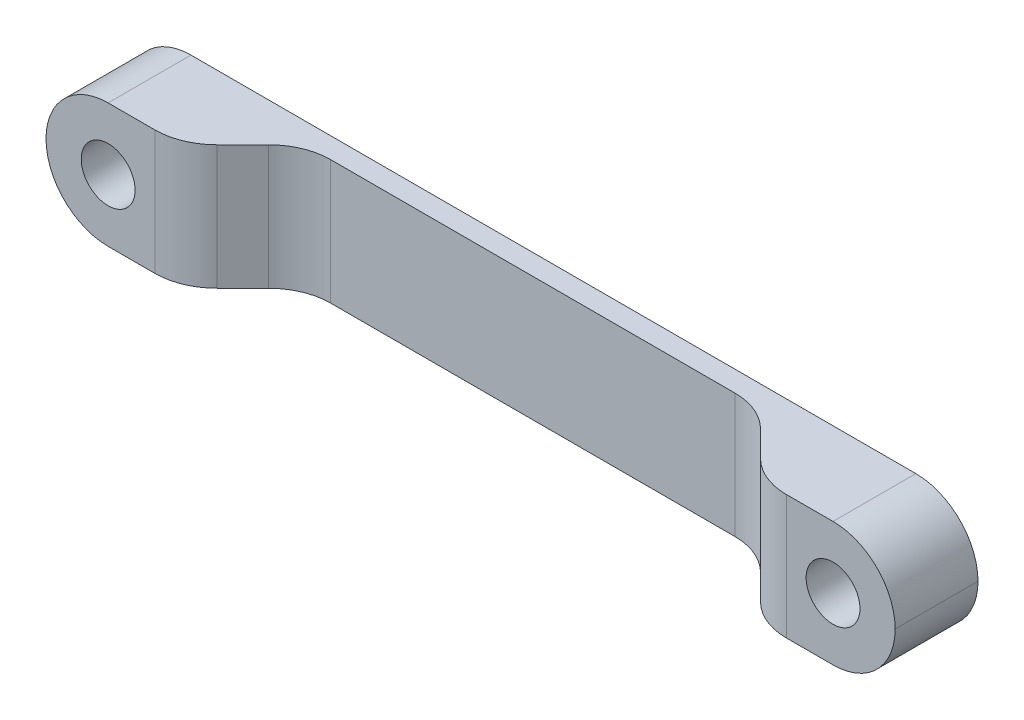
ISO-10303-21;
HEADER;
FILE_DESCRIPTION(('STEP AP214'),'2;1');
FILE_NAME('part.step','',(''),(''),'','','');
FILE_SCHEMA(('AUTOMOTIVE_DESIGN { 1 0 10303 214 1 1 1 1 }'));
ENDSEC;
DATA;
#1=APPLICATION_CONTEXT('core data for automotive mechanical design processes');
#2=APPLICATION_PROTOCOL_DEFINITION('international standard','automotive_design',2000,#1);
#3=PRODUCT_CONTEXT('',#1,'mechanical');
#4=PRODUCT('Part','Part','',(#3));
#5=PRODUCT_RELATED_PRODUCT_CATEGORY('part','',(#4));
#6=PRODUCT_DEFINITION_FORMATION('','',#4);
#7=PRODUCT_DEFINITION_CONTEXT('part definition',#1,'design');
#8=PRODUCT_DEFINITION('design','',#6,#7);
#9=PRODUCT_DEFINITION_SHAPE('','',#8);
#10=(LENGTH_UNIT() NAMED_UNIT(*) SI_UNIT(.MILLI.,.METRE.));
#11=(NAMED_UNIT(*) PLANE_ANGLE_UNIT() SI_UNIT($,.RADIAN.));
#12=(NAMED_UNIT(*) SI_UNIT($,.STERADIAN.) SOLID_ANGLE_UNIT());
#13=UNCERTAINTY_MEASURE_WITH_UNIT(LENGTH_MEASURE(1.E-05),#10,'distance_accuracy_value','');
#14=(GEOMETRIC_REPRESENTATION_CONTEXT(3) GLOBAL_UNCERTAINTY_ASSIGNED_CONTEXT((#13)) GLOBAL_UNIT_ASSIGNED_CONTEXT((#10,
#11,#12)) REPRESENTATION_CONTEXT('',''));
#15=CARTESIAN_POINT('',(0.,0.,0.));
#16=DIRECTION('',(0.,0.,1.));
#17=DIRECTION('',(1.,0.,0.));
#18=AXIS2_PLACEMENT_3D('',#15,#16,#17);
#19=CARTESIAN_POINT('',(0.,0.,4.));
#20=DIRECTION('',(0.,0.,-1.));
#21=DIRECTION('',(-1.,0.,0.));
#22=AXIS2_PLACEMENT_3D('',#19,#20,#21);
#23=PLANE('',#22);
#24=CARTESIAN_POINT('',(-17.5,0.,4.));
#25=DIRECTION('',(0.,0.,1.));
#26=DIRECTION('',(1.,0.,0.));
#27=AXIS2_PLACEMENT_3D('',#24,#25,#26);
#28=CIRCLE('',#27,1.3);
#29=CARTESIAN_POINT('',(-16.2,0.,4.));
#30=VERTEX_POINT('',#29);
#31=EDGE_CURVE('E258',#30,#30,#28,.T.);
#32=ORIENTED_EDGE('',*,*,#31,.F.);
#33=EDGE_LOOP('',(#32));
#34=FACE_BOUND('',#33,.T.);
#35=DIRECTION('',(1.,0.,0.));
#36=VECTOR('',#35,1.);
#37=CARTESIAN_POINT('',(20.5,-3.,4.));
#38=LINE('',#37,#36);
#39=CARTESIAN_POINT('',(-17.5,-3.,4.));
#40=VERTEX_POINT('',#39);
#41=CARTESIAN_POINT('',(-15.2426406871193,-3.,4.));
#42=VERTEX_POINT('',#41);
#43=EDGE_CURVE('E155',#40,#42,#38,.T.);
#44=ORIENTED_EDGE('',*,*,#43,.T.);
#45=DIRECTION('',(0.,1.,0.));
#46=VECTOR('',#45,1.);
#47=CARTESIAN_POINT('',(-15.2426406871193,3.,4.));
#48=LINE('',#47,#46);
#49=CARTESIAN_POINT('',(-15.2426406871193,3.,4.));
#50=VERTEX_POINT('',#49);
#51=EDGE_CURVE('E206',#42,#50,#48,.T.);
#52=ORIENTED_EDGE('',*,*,#51,.T.);
#53=DIRECTION('',(-1.,0.,0.));
#54=VECTOR('',#53,1.);
#55=CARTESIAN_POINT('',(-20.5,3.,4.));
#56=LINE('',#55,#54);
#57=CARTESIAN_POINT('',(-17.5,3.,4.));
#58=VERTEX_POINT('',#57);
#59=EDGE_CURVE('E264',#50,#58,#56,.T.);
#60=ORIENTED_EDGE('',*,*,#59,.T.);
#61=CARTESIAN_POINT('',(-17.5,0.,4.));
#62=DIRECTION('',(0.,0.,-1.));
#63=DIRECTION('',(-1.,0.,0.));
#64=AXIS2_PLACEMENT_3D('',#61,#62,#63);
#65=CIRCLE('',#64,3.);
#66=CARTESIAN_POINT('',(-20.5,0.,4.));
#67=VERTEX_POINT('',#66);
#68=EDGE_CURVE('E183',#58,#67,#65,.F.);
#69=ORIENTED_EDGE('',*,*,#68,.T.);
#70=CARTESIAN_POINT('',(-17.5,0.,4.));
#71=DIRECTION('',(0.,0.,-1.));
#72=DIRECTION('',(-1.,0.,0.));
#73=AXIS2_PLACEMENT_3D('',#70,#71,#72);
#74=CIRCLE('',#73,3.);
#75=EDGE_CURVE('E185',#67,#40,#74,.F.);
#76=ORIENTED_EDGE('',*,*,#75,.T.);
#77=EDGE_LOOP('',(#44,#52,#60,#69,#76));
#78=FACE_BOUND('',#77,.T.);
#79=ADVANCED_FACE('F33',(#34,#78),#23,.F.);
#80=CARTESIAN_POINT('',(17.5,0.,4.));
#81=DIRECTION('',(0.,0.,1.));
#82=DIRECTION('',(1.,0.,0.));
#83=AXIS2_PLACEMENT_3D('',#80,#81,#82);
#84=CIRCLE('',#83,1.3);
#85=CARTESIAN_POINT('',(18.8,0.,4.));
#86=VERTEX_POINT('',#85);
#87=EDGE_CURVE('E164',#86,#86,#84,.T.);
#88=ORIENTED_EDGE('',*,*,#87,.F.);
#89=EDGE_LOOP('',(#88));
#90=FACE_BOUND('',#89,.T.);
#91=CARTESIAN_POINT('',(17.5,3.,4.));
#92=VERTEX_POINT('',#91);
#93=CARTESIAN_POINT('',(15.2426406871193,3.,4.));
#94=VERTEX_POINT('',#93);
#95=EDGE_CURVE('E173',#92,#94,#56,.T.);
#96=ORIENTED_EDGE('',*,*,#95,.T.);
#97=DIRECTION('',(0.,1.,0.));
#98=VECTOR('',#97,1.);
#99=CARTESIAN_POINT('',(15.2426406871193,-3.,4.));
#100=LINE('',#99,#98);
#101=CARTESIAN_POINT('',(15.2426406871193,-3.,4.));
#102=VERTEX_POINT('',#101);
#103=EDGE_CURVE('E231',#94,#102,#100,.F.);
#104=ORIENTED_EDGE('',*,*,#103,.T.);
#105=CARTESIAN_POINT('',(17.5,-3.,4.));
#106=VERTEX_POINT('',#105);
#107=EDGE_CURVE('E167',#102,#106,#38,.T.);
#108=ORIENTED_EDGE('',*,*,#107,.T.);
#109=CARTESIAN_POINT('',(17.5,0.,4.));
#110=DIRECTION('',(0.,0.,-1.));
#111=DIRECTION('',(-1.,0.,0.));
#112=AXIS2_PLACEMENT_3D('',#109,#110,#111);
#113=CIRCLE('',#112,3.);
#114=CARTESIAN_POINT('',(20.5,0.,4.));
#115=VERTEX_POINT('',#114);
#116=EDGE_CURVE('E181',#106,#115,#113,.F.);
#117=ORIENTED_EDGE('',*,*,#116,.T.);
#118=CARTESIAN_POINT('',(17.5,0.,4.));
#119=DIRECTION('',(0.,0.,-1.));
#120=DIRECTION('',(-1.,0.,0.));
#121=AXIS2_PLACEMENT_3D('',#118,#119,#120);
#122=CIRCLE('',#121,3.);
#123=EDGE_CURVE('E144',#115,#92,#122,.F.);
#124=ORIENTED_EDGE('',*,*,#123,.T.);
#125=EDGE_LOOP('',(#96,#104,#108,#117,#124));
#126=FACE_BOUND('',#125,.T.);
#127=ADVANCED_FACE('F271',(#90,#126),#23,.F.);
#128=CARTESIAN_POINT('',(20.5,-3.,4.));
#129=DIRECTION('',(0.,1.,0.));
#130=DIRECTION('',(0.,0.,1.));
#131=AXIS2_PLACEMENT_3D('',#128,#129,#130);
#132=PLANE('',#131);
#133=DIRECTION('',(0.707106781186546,0.,-0.707106781186549));
#134=VECTOR('',#133,1.);
#135=CARTESIAN_POINT('',(3.24999999999994,-3.,-13.25));
#136=LINE('',#135,#134);
#137=CARTESIAN_POINT('',(-13.1213203435596,-3.,3.12132034355964));
#138=VERTEX_POINT('',#137);
#139=CARTESIAN_POINT('',(-11.8786796564404,-3.,1.87867965644036));
#140=VERTEX_POINT('',#139);
#141=EDGE_CURVE('E198',#138,#140,#136,.T.);
#142=ORIENTED_EDGE('',*,*,#141,.F.);
#143=CARTESIAN_POINT('',(-15.2426406871193,-3.,1.));
#144=DIRECTION('',(0.,1.,0.));
#145=DIRECTION('',(0.,0.,1.));
#146=AXIS2_PLACEMENT_3D('',#143,#144,#145);
#147=CIRCLE('',#146,3.);
#148=EDGE_CURVE('E220',#138,#42,#147,.F.);
#149=ORIENTED_EDGE('',*,*,#148,.T.);
#150=ORIENTED_EDGE('',*,*,#43,.F.);
#151=DIRECTION('',(0.,0.,-1.));
#152=VECTOR('',#151,1.);
#153=CARTESIAN_POINT('',(-17.5,-3.,4.));
#154=LINE('',#153,#152);
#155=CARTESIAN_POINT('',(-17.5,-3.,0.));
#156=VERTEX_POINT('',#155);
#157=EDGE_CURVE('E138',#40,#156,#154,.T.);
#158=ORIENTED_EDGE('',*,*,#157,.T.);
#159=DIRECTION('',(1.,0.,0.));
#160=VECTOR('',#159,1.);
#161=CARTESIAN_POINT('',(20.5,-3.,0.));
#162=LINE('',#161,#160);
#163=CARTESIAN_POINT('',(17.5,-3.,0.));
#164=VERTEX_POINT('',#163);
#165=EDGE_CURVE('E152',#156,#164,#162,.T.);
#166=ORIENTED_EDGE('',*,*,#165,.T.);
#167=DIRECTION('',(0.,0.,-1.));
#168=VECTOR('',#167,1.);
#169=CARTESIAN_POINT('',(17.5,-3.,4.));
#170=LINE('',#169,#168);
#171=EDGE_CURVE('E157',#164,#106,#170,.F.);
#172=ORIENTED_EDGE('',*,*,#171,.T.);
#173=ORIENTED_EDGE('',*,*,#107,.F.);
#174=CARTESIAN_POINT('',(15.2426406871193,-3.,1.));
#175=DIRECTION('',(0.,1.,0.));
#176=DIRECTION('',(0.,0.,1.));
#177=AXIS2_PLACEMENT_3D('',#174,#175,#176);
#178=CIRCLE('',#177,3.);
#179=CARTESIAN_POINT('',(13.1213203435596,-3.,3.12132034355964));
#180=VERTEX_POINT('',#179);
#181=EDGE_CURVE('E218',#102,#180,#178,.F.);
#182=ORIENTED_EDGE('',*,*,#181,.T.);
#183=DIRECTION('',(0.707106781186546,0.,0.707106781186549));
#184=VECTOR('',#183,1.);
#185=CARTESIAN_POINT('',(17.25,-3.,7.25));
#186=LINE('',#185,#184);
#187=CARTESIAN_POINT('',(11.8786796564404,-3.,1.87867965644036));
#188=VERTEX_POINT('',#187);
#189=EDGE_CURVE('E252',#188,#180,#186,.T.);
#190=ORIENTED_EDGE('',*,*,#189,.F.);
#191=CARTESIAN_POINT('',(9.75735931288073,-3.,4.));
#192=DIRECTION('',(0.,1.,0.));
#193=DIRECTION('',(0.,0.,1.));
#194=AXIS2_PLACEMENT_3D('',#191,#192,#193);
#195=CIRCLE('',#194,3.);
#196=CARTESIAN_POINT('',(9.75735931288073,-3.,1.));
#197=VERTEX_POINT('',#196);
#198=EDGE_CURVE('E11',#188,#197,#195,.T.);
#199=ORIENTED_EDGE('',*,*,#198,.T.);
#200=DIRECTION('',(1.,0.,0.));
#201=VECTOR('',#200,1.);
#202=CARTESIAN_POINT('',(20.5,-3.,1.));
#203=LINE('',#202,#201);
#204=CARTESIAN_POINT('',(-9.75735931288072,-3.,1.));
#205=VERTEX_POINT('',#204);
#206=EDGE_CURVE('E250',#205,#197,#203,.T.);
#207=ORIENTED_EDGE('',*,*,#206,.F.);
#208=CARTESIAN_POINT('',(-9.75735931288072,-3.,4.));
#209=DIRECTION('',(0.,1.,0.));
#210=DIRECTION('',(0.,0.,1.));
#211=AXIS2_PLACEMENT_3D('',#208,#209,#210);
#212=CIRCLE('',#211,3.);
#213=EDGE_CURVE('E235',#205,#140,#212,.T.);
#214=ORIENTED_EDGE('',*,*,#213,.T.);
#215=EDGE_LOOP('',(#142,#149,#150,#158,#166,#172,#173,#182,#190,#199,#207,#214));
#216=FACE_BOUND('',#215,.T.);
#217=ADVANCED_FACE('F150',(#216),#132,.F.);
#218=CARTESIAN_POINT('',(-20.5,3.,4.));
#219=DIRECTION('',(0.,-1.,0.));
#220=DIRECTION('',(0.,0.,-1.));
#221=AXIS2_PLACEMENT_3D('',#218,#219,#220);
#222=PLANE('',#221);
#223=ORIENTED_EDGE('',*,*,#59,.F.);
#224=CARTESIAN_POINT('',(-15.2426406871193,3.,1.));
#225=DIRECTION('',(0.,-1.,0.));
#226=DIRECTION('',(0.,0.,-1.));
#227=AXIS2_PLACEMENT_3D('',#224,#225,#226);
#228=CIRCLE('',#227,3.);
#229=CARTESIAN_POINT('',(-13.1213203435596,3.,3.12132034355964));
#230=VERTEX_POINT('',#229);
#231=EDGE_CURVE('E211',#50,#230,#228,.F.);
#232=ORIENTED_EDGE('',*,*,#231,.T.);
#233=DIRECTION('',(-0.707106781186546,0.,0.707106781186549));
#234=VECTOR('',#233,1.);
#235=CARTESIAN_POINT('',(-17.25,3.,7.25));
#236=LINE('',#235,#234);
#237=CARTESIAN_POINT('',(-11.8786796564404,3.,1.87867965644036));
#238=VERTEX_POINT('',#237);
#239=EDGE_CURVE('E203',#238,#230,#236,.T.);
#240=ORIENTED_EDGE('',*,*,#239,.F.);
#241=CARTESIAN_POINT('',(-9.75735931288072,3.,4.));
#242=DIRECTION('',(0.,-1.,0.));
#243=DIRECTION('',(0.,0.,-1.));
#244=AXIS2_PLACEMENT_3D('',#241,#242,#243);
#245=CIRCLE('',#244,3.);
#246=CARTESIAN_POINT('',(-9.75735931288072,3.,1.));
#247=VERTEX_POINT('',#246);
#248=EDGE_CURVE('E233',#238,#247,#245,.T.);
#249=ORIENTED_EDGE('',*,*,#248,.T.);
#250=DIRECTION('',(-1.,0.,0.));
#251=VECTOR('',#250,1.);
#252=CARTESIAN_POINT('',(-20.5,3.,1.));
#253=LINE('',#252,#251);
#254=CARTESIAN_POINT('',(9.75735931288072,3.,1.));
#255=VERTEX_POINT('',#254);
#256=EDGE_CURVE('E201',#255,#247,#253,.T.);
#257=ORIENTED_EDGE('',*,*,#256,.F.);
#258=CARTESIAN_POINT('',(9.75735931288073,3.,4.));
#259=DIRECTION('',(0.,-1.,0.));
#260=DIRECTION('',(0.,0.,-1.));
#261=AXIS2_PLACEMENT_3D('',#258,#259,#260);
#262=CIRCLE('',#261,3.);
#263=CARTESIAN_POINT('',(11.8786796564404,3.,1.87867965644036));
#264=VERTEX_POINT('',#263);
#265=EDGE_CURVE('E41',#255,#264,#262,.T.);
#266=ORIENTED_EDGE('',*,*,#265,.T.);
#267=DIRECTION('',(-0.707106781186546,0.,-0.707106781186549));
#268=VECTOR('',#267,1.);
#269=CARTESIAN_POINT('',(-3.24999999999995,3.,-13.25));
#270=LINE('',#269,#268);
#271=CARTESIAN_POINT('',(13.1213203435596,3.,3.12132034355964));
#272=VERTEX_POINT('',#271);
#273=EDGE_CURVE('E192',#272,#264,#270,.T.);
#274=ORIENTED_EDGE('',*,*,#273,.F.);
#275=CARTESIAN_POINT('',(15.2426406871193,3.,1.));
#276=DIRECTION('',(0.,-1.,0.));
#277=DIRECTION('',(0.,0.,-1.));
#278=AXIS2_PLACEMENT_3D('',#275,#276,#277);
#279=CIRCLE('',#278,3.);
#280=EDGE_CURVE('E209',#272,#94,#279,.F.);
#281=ORIENTED_EDGE('',*,*,#280,.T.);
#282=ORIENTED_EDGE('',*,*,#95,.F.);
#283=DIRECTION('',(0.,0.,-1.));
#284=VECTOR('',#283,1.);
#285=CARTESIAN_POINT('',(17.5,3.,4.));
#286=LINE('',#285,#284);
#287=CARTESIAN_POINT('',(17.5,3.,0.));
#288=VERTEX_POINT('',#287);
#289=EDGE_CURVE('E187',#92,#288,#286,.T.);
#290=ORIENTED_EDGE('',*,*,#289,.T.);
#291=DIRECTION('',(-1.,0.,0.));
#292=VECTOR('',#291,1.);
#293=CARTESIAN_POINT('',(-20.5,3.,0.));
#294=LINE('',#293,#292);
#295=CARTESIAN_POINT('',(-17.5,3.,0.));
#296=VERTEX_POINT('',#295);
#297=EDGE_CURVE('E163',#288,#296,#294,.T.);
#298=ORIENTED_EDGE('',*,*,#297,.T.);
#299=DIRECTION('',(0.,0.,-1.));
#300=VECTOR('',#299,1.);
#301=CARTESIAN_POINT('',(-17.5,3.,4.));
#302=LINE('',#301,#300);
#303=EDGE_CURVE('E189',#296,#58,#302,.F.);
#304=ORIENTED_EDGE('',*,*,#303,.T.);
#305=EDGE_LOOP('',(#223,#232,#240,#249,#257,#266,#274,#281,#282,#290,#298,#304));
#306=FACE_BOUND('',#305,.T.);
#307=ADVANCED_FACE('F240',(#306),#222,.F.);
#308=CARTESIAN_POINT('',(0.,0.,0.));
#309=DIRECTION('',(0.,0.,-1.));
#310=DIRECTION('',(-1.,0.,0.));
#311=AXIS2_PLACEMENT_3D('',#308,#309,#310);
#312=PLANE('',#311);
#313=CARTESIAN_POINT('',(17.5,0.,0.));
#314=DIRECTION('',(0.,0.,1.));
#315=DIRECTION('',(1.,0.,0.));
#316=AXIS2_PLACEMENT_3D('',#313,#314,#315);
#317=CIRCLE('',#316,1.3);
#318=CARTESIAN_POINT('',(18.8,0.,0.));
#319=VERTEX_POINT('',#318);
#320=EDGE_CURVE('E170',#319,#319,#317,.T.);
#321=ORIENTED_EDGE('',*,*,#320,.T.);
#322=EDGE_LOOP('',(#321));
#323=FACE_BOUND('',#322,.T.);
#324=ORIENTED_EDGE('',*,*,#165,.F.);
#325=CARTESIAN_POINT('',(-17.5,0.,0.));
#326=DIRECTION('',(0.,0.,-1.));
#327=DIRECTION('',(-1.,0.,0.));
#328=AXIS2_PLACEMENT_3D('',#325,#326,#327);
#329=CIRCLE('',#328,3.);
#330=CARTESIAN_POINT('',(-20.5,0.,0.));
#331=VERTEX_POINT('',#330);
#332=EDGE_CURVE('E134',#156,#331,#329,.T.);
#333=ORIENTED_EDGE('',*,*,#332,.T.);
#334=CARTESIAN_POINT('',(-17.5,0.,0.));
#335=DIRECTION('',(0.,0.,-1.));
#336=DIRECTION('',(-1.,0.,0.));
#337=AXIS2_PLACEMENT_3D('',#334,#335,#336);
#338=CIRCLE('',#337,3.);
#339=EDGE_CURVE('E145',#331,#296,#338,.T.);
#340=ORIENTED_EDGE('',*,*,#339,.T.);
#341=ORIENTED_EDGE('',*,*,#297,.F.);
#342=CARTESIAN_POINT('',(17.5,0.,0.));
#343=DIRECTION('',(0.,0.,-1.));
#344=DIRECTION('',(-1.,0.,0.));
#345=AXIS2_PLACEMENT_3D('',#342,#343,#344);
#346=CIRCLE('',#345,3.);
#347=CARTESIAN_POINT('',(20.5,0.,0.));
#348=VERTEX_POINT('',#347);
#349=EDGE_CURVE('E156',#288,#348,#346,.T.);
#350=ORIENTED_EDGE('',*,*,#349,.T.);
#351=CARTESIAN_POINT('',(17.5,0.,0.));
#352=DIRECTION('',(0.,0.,-1.));
#353=DIRECTION('',(-1.,0.,0.));
#354=AXIS2_PLACEMENT_3D('',#351,#352,#353);
#355=CIRCLE('',#354,3.);
#356=EDGE_CURVE('E162',#348,#164,#355,.T.);
#357=ORIENTED_EDGE('',*,*,#356,.T.);
#358=EDGE_LOOP('',(#324,#333,#340,#341,#350,#357));
#359=FACE_BOUND('',#358,.T.);
#360=CARTESIAN_POINT('',(-17.5,0.,0.));
#361=DIRECTION('',(0.,0.,1.));
#362=DIRECTION('',(1.,0.,0.));
#363=AXIS2_PLACEMENT_3D('',#360,#361,#362);
#364=CIRCLE('',#363,1.3);
#365=CARTESIAN_POINT('',(-16.2,0.,0.));
#366=VERTEX_POINT('',#365);
#367=EDGE_CURVE('E194',#366,#366,#364,.T.);
#368=ORIENTED_EDGE('',*,*,#367,.T.);
#369=EDGE_LOOP('',(#368));
#370=FACE_BOUND('',#369,.T.);
#371=ADVANCED_FACE('F159',(#323,#359,#370),#312,.T.);
#372=CARTESIAN_POINT('',(17.5,0.,4.));
#373=DIRECTION('',(0.,0.,-1.));
#374=DIRECTION('',(-1.,0.,0.));
#375=AXIS2_PLACEMENT_3D('',#372,#373,#374);
#376=CYLINDRICAL_SURFACE('',#375,1.3);
#377=ORIENTED_EDGE('',*,*,#87,.T.);
#378=EDGE_LOOP('',(#377));
#379=FACE_BOUND('',#378,.T.);
#380=ORIENTED_EDGE('',*,*,#320,.F.);
#381=EDGE_LOOP('',(#380));
#382=FACE_BOUND('',#381,.T.);
#383=ADVANCED_FACE('F300',(#379,#382),#376,.F.);
#384=CARTESIAN_POINT('',(-17.5,0.,4.));
#385=DIRECTION('',(0.,0.,-1.));
#386=DIRECTION('',(-1.,0.,0.));
#387=AXIS2_PLACEMENT_3D('',#384,#385,#386);
#388=CYLINDRICAL_SURFACE('',#387,1.3);
#389=ORIENTED_EDGE('',*,*,#31,.T.);
#390=EDGE_LOOP('',(#389));
#391=FACE_BOUND('',#390,.T.);
#392=ORIENTED_EDGE('',*,*,#367,.F.);
#393=EDGE_LOOP('',(#392));
#394=FACE_BOUND('',#393,.T.);
#395=ADVANCED_FACE('F314',(#391,#394),#388,.F.);
#396=CARTESIAN_POINT('',(-17.5,0.,4.));
#397=DIRECTION('',(0.,0.,-1.));
#398=DIRECTION('',(-1.,0.,0.));
#399=AXIS2_PLACEMENT_3D('',#396,#397,#398);
#400=CYLINDRICAL_SURFACE('',#399,3.);
#401=DIRECTION('',(0.,0.,-1.));
#402=VECTOR('',#401,1.);
#403=CARTESIAN_POINT('',(-20.5,0.,4.));
#404=LINE('',#403,#402);
#405=EDGE_CURVE('E140',#67,#331,#404,.T.);
#406=ORIENTED_EDGE('',*,*,#405,.F.);
#407=ORIENTED_EDGE('',*,*,#68,.F.);
#408=ORIENTED_EDGE('',*,*,#303,.F.);
#409=ORIENTED_EDGE('',*,*,#339,.F.);
#410=EDGE_LOOP('',(#406,#407,#408,#409));
#411=FACE_BOUND('',#410,.T.);
#412=ADVANCED_FACE('F311',(#411),#400,.T.);
#413=CARTESIAN_POINT('',(-17.5,0.,4.));
#414=DIRECTION('',(0.,0.,-1.));
#415=DIRECTION('',(-1.,0.,0.));
#416=AXIS2_PLACEMENT_3D('',#413,#414,#415);
#417=CYLINDRICAL_SURFACE('',#416,3.);
#418=ORIENTED_EDGE('',*,*,#75,.F.);
#419=ORIENTED_EDGE('',*,*,#405,.T.);
#420=ORIENTED_EDGE('',*,*,#332,.F.);
#421=ORIENTED_EDGE('',*,*,#157,.F.);
#422=EDGE_LOOP('',(#418,#419,#420,#421));
#423=FACE_BOUND('',#422,.T.);
#424=ADVANCED_FACE('F137',(#423),#417,.T.);
#425=CARTESIAN_POINT('',(17.5,0.,4.));
#426=DIRECTION('',(0.,0.,-1.));
#427=DIRECTION('',(-1.,0.,0.));
#428=AXIS2_PLACEMENT_3D('',#425,#426,#427);
#429=CYLINDRICAL_SURFACE('',#428,3.);
#430=ORIENTED_EDGE('',*,*,#289,.F.);
#431=ORIENTED_EDGE('',*,*,#123,.F.);
#432=DIRECTION('',(0.,0.,-1.));
#433=VECTOR('',#432,1.);
#434=CARTESIAN_POINT('',(20.5,0.,4.));
#435=LINE('',#434,#433);
#436=EDGE_CURVE('E195',#348,#115,#435,.F.);
#437=ORIENTED_EDGE('',*,*,#436,.F.);
#438=ORIENTED_EDGE('',*,*,#349,.F.);
#439=EDGE_LOOP('',(#430,#431,#437,#438));
#440=FACE_BOUND('',#439,.T.);
#441=ADVANCED_FACE('F281',(#440),#429,.T.);
#442=CARTESIAN_POINT('',(17.5,0.,4.));
#443=DIRECTION('',(0.,0.,-1.));
#444=DIRECTION('',(-1.,0.,0.));
#445=AXIS2_PLACEMENT_3D('',#442,#443,#444);
#446=CYLINDRICAL_SURFACE('',#445,3.);
#447=ORIENTED_EDGE('',*,*,#116,.F.);
#448=ORIENTED_EDGE('',*,*,#171,.F.);
#449=ORIENTED_EDGE('',*,*,#356,.F.);
#450=ORIENTED_EDGE('',*,*,#436,.T.);
#451=EDGE_LOOP('',(#447,#448,#449,#450));
#452=FACE_BOUND('',#451,.T.);
#453=ADVANCED_FACE('F276',(#452),#446,.T.);
#454=CARTESIAN_POINT('',(-14.,-58.7866457412466,4.));
#455=DIRECTION('',(0.707106781186549,0.,0.707106781186546));
#456=DIRECTION('',(0.707106781186546,0.,-0.707106781186549));
#457=AXIS2_PLACEMENT_3D('',#454,#455,#456);
#458=PLANE('',#457);
#459=ORIENTED_EDGE('',*,*,#239,.T.);
#460=DIRECTION('',(0.,1.,0.));
#461=VECTOR('',#460,1.);
#462=CARTESIAN_POINT('',(-13.1213203435596,-3.,3.12132034355964));
#463=LINE('',#462,#461);
#464=EDGE_CURVE('E216',#230,#138,#463,.F.);
#465=ORIENTED_EDGE('',*,*,#464,.T.);
#466=ORIENTED_EDGE('',*,*,#141,.T.);
#467=DIRECTION('',(0.,1.,0.));
#468=VECTOR('',#467,1.);
#469=CARTESIAN_POINT('',(-11.8786796564404,3.,1.87867965644036));
#470=LINE('',#469,#468);
#471=EDGE_CURVE('E213',#140,#238,#470,.T.);
#472=ORIENTED_EDGE('',*,*,#471,.T.);
#473=EDGE_LOOP('',(#459,#465,#466,#472));
#474=FACE_BOUND('',#473,.T.);
#475=ADVANCED_FACE('F318',(#474),#458,.T.);
#476=CARTESIAN_POINT('',(-11.,-58.7866457412466,1.));
#477=DIRECTION('',(0.,0.,1.));
#478=DIRECTION('',(1.,0.,0.));
#479=AXIS2_PLACEMENT_3D('',#476,#477,#478);
#480=PLANE('',#479);
#481=ORIENTED_EDGE('',*,*,#256,.T.);
#482=DIRECTION('',(0.,1.,0.));
#483=VECTOR('',#482,1.);
#484=CARTESIAN_POINT('',(-9.75735931288072,-3.,1.));
#485=LINE('',#484,#483);
#486=EDGE_CURVE('E53',#247,#205,#485,.F.);
#487=ORIENTED_EDGE('',*,*,#486,.T.);
#488=ORIENTED_EDGE('',*,*,#206,.T.);
#489=DIRECTION('',(0.,1.,0.));
#490=VECTOR('',#489,1.);
#491=CARTESIAN_POINT('',(9.75735931288073,3.,1.));
#492=LINE('',#491,#490);
#493=EDGE_CURVE('E222',#197,#255,#492,.T.);
#494=ORIENTED_EDGE('',*,*,#493,.T.);
#495=EDGE_LOOP('',(#481,#487,#488,#494));
#496=FACE_BOUND('',#495,.T.);
#497=ADVANCED_FACE('F249',(#496),#480,.T.);
#498=CARTESIAN_POINT('',(11.,-58.7866457412466,1.));
#499=DIRECTION('',(-0.707106781186549,0.,0.707106781186546));
#500=DIRECTION('',(0.707106781186546,0.,0.707106781186549));
#501=AXIS2_PLACEMENT_3D('',#498,#499,#500);
#502=PLANE('',#501);
#503=ORIENTED_EDGE('',*,*,#273,.T.);
#504=DIRECTION('',(0.,1.,0.));
#505=VECTOR('',#504,1.);
#506=CARTESIAN_POINT('',(11.8786796564404,-3.,1.87867965644036));
#507=LINE('',#506,#505);
#508=EDGE_CURVE('E229',#264,#188,#507,.F.);
#509=ORIENTED_EDGE('',*,*,#508,.T.);
#510=ORIENTED_EDGE('',*,*,#189,.T.);
#511=DIRECTION('',(0.,1.,0.));
#512=VECTOR('',#511,1.);
#513=CARTESIAN_POINT('',(13.1213203435596,3.,3.12132034355964));
#514=LINE('',#513,#512);
#515=EDGE_CURVE('E226',#180,#272,#514,.T.);
#516=ORIENTED_EDGE('',*,*,#515,.T.);
#517=EDGE_LOOP('',(#503,#509,#510,#516));
#518=FACE_BOUND('',#517,.T.);
#519=ADVANCED_FACE('F245',(#518),#502,.T.);
#520=CARTESIAN_POINT('',(-15.2426406871193,0.,1.));
#521=DIRECTION('',(0.,-1.,0.));
#522=DIRECTION('',(0.,0.,-1.));
#523=AXIS2_PLACEMENT_3D('',#520,#521,#522);
#524=CYLINDRICAL_SURFACE('',#523,3.);
#525=ORIENTED_EDGE('',*,*,#148,.F.);
#526=ORIENTED_EDGE('',*,*,#464,.F.);
#527=ORIENTED_EDGE('',*,*,#231,.F.);
#528=ORIENTED_EDGE('',*,*,#51,.F.);
#529=EDGE_LOOP('',(#525,#526,#527,#528));
#530=FACE_BOUND('',#529,.T.);
#531=ADVANCED_FACE('F321',(#530),#524,.T.);
#532=CARTESIAN_POINT('',(-9.75735931288072,-58.7866457412466,4.));
#533=DIRECTION('',(0.,-1.,0.));
#534=DIRECTION('',(0.,0.,-1.));
#535=AXIS2_PLACEMENT_3D('',#532,#533,#534);
#536=CYLINDRICAL_SURFACE('',#535,3.);
#537=ORIENTED_EDGE('',*,*,#213,.F.);
#538=ORIENTED_EDGE('',*,*,#486,.F.);
#539=ORIENTED_EDGE('',*,*,#248,.F.);
#540=ORIENTED_EDGE('',*,*,#471,.F.);
#541=EDGE_LOOP('',(#537,#538,#539,#540));
#542=FACE_BOUND('',#541,.T.);
#543=ADVANCED_FACE('F289',(#542),#536,.F.);
#544=CARTESIAN_POINT('',(9.75735931288073,-58.7866457412466,4.));
#545=DIRECTION('',(0.,-1.,0.));
#546=DIRECTION('',(0.,0.,-1.));
#547=AXIS2_PLACEMENT_3D('',#544,#545,#546);
#548=CYLINDRICAL_SURFACE('',#547,3.);
#549=ORIENTED_EDGE('',*,*,#198,.F.);
#550=ORIENTED_EDGE('',*,*,#508,.F.);
#551=ORIENTED_EDGE('',*,*,#265,.F.);
#552=ORIENTED_EDGE('',*,*,#493,.F.);
#553=EDGE_LOOP('',(#549,#550,#551,#552));
#554=FACE_BOUND('',#553,.T.);
#555=ADVANCED_FACE('F248',(#554),#548,.F.);
#556=CARTESIAN_POINT('',(15.2426406871193,-58.7866457412466,1.));
#557=DIRECTION('',(0.,-1.,0.));
#558=DIRECTION('',(0.,0.,-1.));
#559=AXIS2_PLACEMENT_3D('',#556,#557,#558);
#560=CYLINDRICAL_SURFACE('',#559,3.);
#561=ORIENTED_EDGE('',*,*,#181,.F.);
#562=ORIENTED_EDGE('',*,*,#103,.F.);
#563=ORIENTED_EDGE('',*,*,#280,.F.);
#564=ORIENTED_EDGE('',*,*,#515,.F.);
#565=EDGE_LOOP('',(#561,#562,#563,#564));
#566=FACE_BOUND('',#565,.T.);
#567=ADVANCED_FACE('F35',(#566),#560,.T.);
#568=CLOSED_SHELL('',(#79,#127,#217,#307,#371,#383,#395,#412,#424,#441,#453,#475,#497,#519,#531,
#543,#555,#567));
#569=MANIFOLD_SOLID_BREP('B2',#568);
#570=ADVANCED_BREP_SHAPE_REPRESENTATION('',(#18,#569),#14);
#571=SHAPE_DEFINITION_REPRESENTATION(#9,#570);
ENDSEC;
END-ISO-10303-21;
